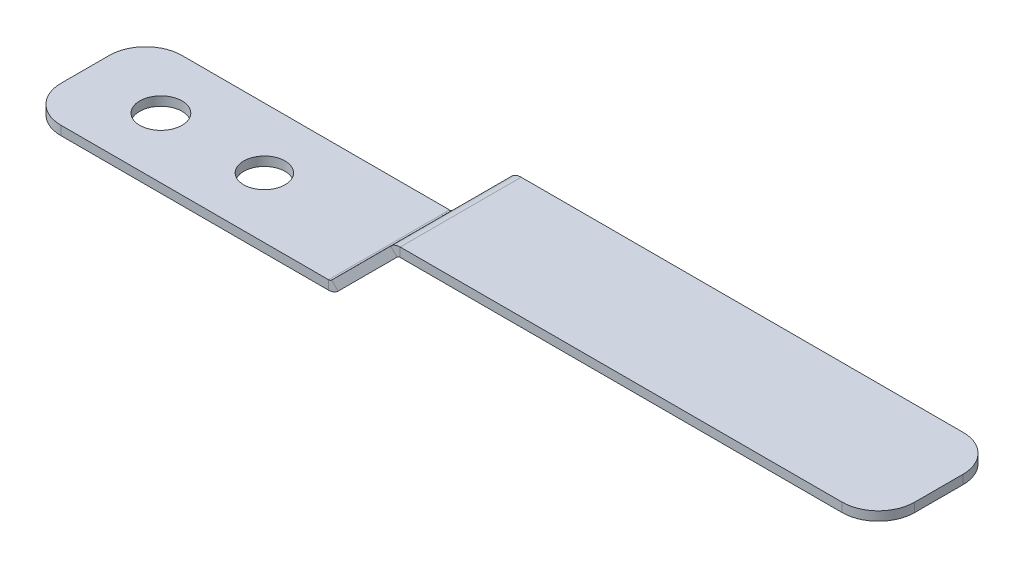
ISO-10303-21;
HEADER;
FILE_DESCRIPTION(('STEP AP214'),'2;1');
FILE_NAME('part.step','',(''),(''),'','','');
FILE_SCHEMA(('AUTOMOTIVE_DESIGN { 1 0 10303 214 1 1 1 1 }'));
ENDSEC;
DATA;
#1=APPLICATION_CONTEXT('core data for automotive mechanical design processes');
#2=APPLICATION_PROTOCOL_DEFINITION('international standard','automotive_design',2000,#1);
#3=PRODUCT_CONTEXT('',#1,'mechanical');
#4=PRODUCT('Part','Part','',(#3));
#5=PRODUCT_RELATED_PRODUCT_CATEGORY('part','',(#4));
#6=PRODUCT_DEFINITION_FORMATION('','',#4);
#7=PRODUCT_DEFINITION_CONTEXT('part definition',#1,'design');
#8=PRODUCT_DEFINITION('design','',#6,#7);
#9=PRODUCT_DEFINITION_SHAPE('','',#8);
#10=(LENGTH_UNIT() NAMED_UNIT(*) SI_UNIT(.MILLI.,.METRE.));
#11=(NAMED_UNIT(*) PLANE_ANGLE_UNIT() SI_UNIT($,.RADIAN.));
#12=(NAMED_UNIT(*) SI_UNIT($,.STERADIAN.) SOLID_ANGLE_UNIT());
#13=UNCERTAINTY_MEASURE_WITH_UNIT(LENGTH_MEASURE(1.E-05),#10,'distance_accuracy_value','');
#14=(GEOMETRIC_REPRESENTATION_CONTEXT(3) GLOBAL_UNCERTAINTY_ASSIGNED_CONTEXT((#13)) GLOBAL_UNIT_ASSIGNED_CONTEXT((#10,
#11,#12)) REPRESENTATION_CONTEXT('',''));
#15=CARTESIAN_POINT('',(0.,0.,0.));
#16=DIRECTION('',(0.,0.,1.));
#17=DIRECTION('',(1.,0.,0.));
#18=AXIS2_PLACEMENT_3D('',#15,#16,#17);
#19=CARTESIAN_POINT('',(69.964219907714,107.580840304424,20.));
#20=DIRECTION('',(0.,0.,1.));
#21=DIRECTION('',(1.,0.,0.));
#22=AXIS2_PLACEMENT_3D('',#19,#20,#21);
#23=PLANE('',#22);
#24=DIRECTION('',(0.706860060304083,-0.707353416014165,0.));
#25=VECTOR('',#24,1.);
#26=CARTESIAN_POINT('',(69.964219907714,107.580840304424,20.));
#27=LINE('',#26,#25);
#28=CARTESIAN_POINT('',(69.964219907714,107.580840304424,20.));
#29=VERTEX_POINT('',#28);
#30=CARTESIAN_POINT('',(71.0245099981701,106.519810180403,20.));
#31=VERTEX_POINT('',#30);
#32=EDGE_CURVE('E270',#29,#31,#27,.T.);
#33=ORIENTED_EDGE('',*,*,#32,.F.);
#34=CARTESIAN_POINT('',(69.443546787294,108.10187683066,20.));
#35=DIRECTION('',(0.,0.,-1.));
#36=DIRECTION('',(-1.,0.,0.));
#37=AXIS2_PLACEMENT_3D('',#34,#35,#36);
#38=CIRCLE('',#37,0.7366);
#39=CARTESIAN_POINT('',(69.443546787294,107.36527683066,20.));
#40=VERTEX_POINT('',#39);
#41=EDGE_CURVE('E186',#40,#29,#38,.F.);
#42=ORIENTED_EDGE('',*,*,#41,.F.);
#43=DIRECTION('',(0.,1.,0.));
#44=VECTOR('',#43,1.);
#45=CARTESIAN_POINT('',(69.443546787294,105.86527683066,20.));
#46=LINE('',#45,#44);
#47=CARTESIAN_POINT('',(69.443546787294,105.86527683066,20.));
#48=VERTEX_POINT('',#47);
#49=EDGE_CURVE('E267',#48,#40,#46,.T.);
#50=ORIENTED_EDGE('',*,*,#49,.F.);
#51=CARTESIAN_POINT('',(69.443546787294,108.10187683066,20.));
#52=DIRECTION('',(0.,0.,1.));
#53=DIRECTION('',(1.,0.,0.));
#54=AXIS2_PLACEMENT_3D('',#51,#52,#53);
#55=CIRCLE('',#54,2.2366);
#56=EDGE_CURVE('E196',#48,#31,#55,.T.);
#57=ORIENTED_EDGE('',*,*,#56,.T.);
#58=EDGE_LOOP('',(#33,#42,#50,#57));
#59=FACE_BOUND('',#58,.T.);
#60=ADVANCED_FACE('F37',(#59),#23,.T.);
#61=CARTESIAN_POINT('',(69.443546787294,105.86527683066,20.));
#62=DIRECTION('',(0.,0.,1.));
#63=DIRECTION('',(1.,0.,0.));
#64=AXIS2_PLACEMENT_3D('',#61,#62,#63);
#65=PLANE('',#64);
#66=DIRECTION('',(0.707353416014164,0.706860060304084,0.));
#67=VECTOR('',#66,1.);
#68=CARTESIAN_POINT('',(69.7485059805906,107.36527683066,20.));
#69=LINE('',#68,#67);
#70=CARTESIAN_POINT('',(79.7120651902022,117.321886785885,20.));
#71=VERTEX_POINT('',#70);
#72=EDGE_CURVE('E184',#29,#71,#69,.T.);
#73=ORIENTED_EDGE('',*,*,#72,.F.);
#74=ORIENTED_EDGE('',*,*,#32,.T.);
#75=DIRECTION('',(0.707353416014164,0.706860060304084,0.));
#76=VECTOR('',#75,1.);
#77=CARTESIAN_POINT('',(70.8087960710467,106.304246706639,20.));
#78=LINE('',#77,#76);
#79=CARTESIAN_POINT('',(80.7723552806583,116.260856661864,20.));
#80=VERTEX_POINT('',#79);
#81=EDGE_CURVE('E199',#31,#80,#78,.T.);
#82=ORIENTED_EDGE('',*,*,#81,.T.);
#83=DIRECTION('',(-0.706860060304083,0.707353416014165,0.));
#84=VECTOR('',#83,1.);
#85=CARTESIAN_POINT('',(80.7723552806583,116.260856661864,20.));
#86=LINE('',#85,#84);
#87=EDGE_CURVE('E164',#80,#71,#86,.T.);
#88=ORIENTED_EDGE('',*,*,#87,.T.);
#89=EDGE_LOOP('',(#73,#74,#82,#88));
#90=FACE_BOUND('',#89,.T.);
#91=ADVANCED_FACE('F392',(#90),#65,.T.);
#92=CARTESIAN_POINT('',(69.443546787294,107.36527683066,0.));
#93=DIRECTION('',(0.,0.,-1.));
#94=DIRECTION('',(-1.,0.,0.));
#95=AXIS2_PLACEMENT_3D('',#92,#93,#94);
#96=PLANE('',#95);
#97=DIRECTION('',(0.,-1.,0.));
#98=VECTOR('',#97,1.);
#99=CARTESIAN_POINT('',(69.443546787294,107.36527683066,0.));
#100=LINE('',#99,#98);
#101=CARTESIAN_POINT('',(69.443546787294,107.36527683066,0.));
#102=VERTEX_POINT('',#101);
#103=CARTESIAN_POINT('',(69.443546787294,105.86527683066,0.));
#104=VERTEX_POINT('',#103);
#105=EDGE_CURVE('E264',#102,#104,#100,.T.);
#106=ORIENTED_EDGE('',*,*,#105,.F.);
#107=CARTESIAN_POINT('',(69.443546787294,108.10187683066,0.));
#108=DIRECTION('',(0.,0.,-1.));
#109=DIRECTION('',(-1.,0.,0.));
#110=AXIS2_PLACEMENT_3D('',#107,#108,#109);
#111=CIRCLE('',#110,0.7366);
#112=CARTESIAN_POINT('',(69.964219907714,107.580840304424,0.));
#113=VERTEX_POINT('',#112);
#114=EDGE_CURVE('E214',#102,#113,#111,.F.);
#115=ORIENTED_EDGE('',*,*,#114,.T.);
#116=DIRECTION('',(-0.706860060304083,0.707353416014165,0.));
#117=VECTOR('',#116,1.);
#118=CARTESIAN_POINT('',(71.0245099981701,106.519810180403,0.));
#119=LINE('',#118,#117);
#120=CARTESIAN_POINT('',(71.0245099981701,106.519810180403,0.));
#121=VERTEX_POINT('',#120);
#122=EDGE_CURVE('E163',#121,#113,#119,.T.);
#123=ORIENTED_EDGE('',*,*,#122,.F.);
#124=CARTESIAN_POINT('',(69.443546787294,108.10187683066,0.));
#125=DIRECTION('',(0.,0.,1.));
#126=DIRECTION('',(1.,0.,0.));
#127=AXIS2_PLACEMENT_3D('',#124,#125,#126);
#128=CIRCLE('',#127,2.2366);
#129=EDGE_CURVE('E221',#104,#121,#128,.T.);
#130=ORIENTED_EDGE('',*,*,#129,.F.);
#131=EDGE_LOOP('',(#106,#115,#123,#130));
#132=FACE_BOUND('',#131,.T.);
#133=ADVANCED_FACE('F360',(#132),#96,.T.);
#134=CARTESIAN_POINT('',(71.0245099981701,106.519810180403,0.));
#135=DIRECTION('',(0.,0.,-1.));
#136=DIRECTION('',(-1.,0.,0.));
#137=AXIS2_PLACEMENT_3D('',#134,#135,#136);
#138=PLANE('',#137);
#139=DIRECTION('',(1.,0.,0.));
#140=VECTOR('',#139,1.);
#141=CARTESIAN_POINT('',(19.1848311400412,105.86527683066,0.));
#142=LINE('',#141,#140);
#143=CARTESIAN_POINT('',(25.1848311400412,105.86527683066,0.));
#144=VERTEX_POINT('',#143);
#145=EDGE_CURVE('E219',#144,#104,#142,.T.);
#146=ORIENTED_EDGE('',*,*,#145,.F.);
#147=DIRECTION('',(0.,1.,0.));
#148=VECTOR('',#147,1.);
#149=CARTESIAN_POINT('',(25.1848311400412,106.519810180403,0.));
#150=LINE('',#149,#148);
#151=CARTESIAN_POINT('',(25.1848311400412,107.36527683066,0.));
#152=VERTEX_POINT('',#151);
#153=EDGE_CURVE('E294',#144,#152,#150,.T.);
#154=ORIENTED_EDGE('',*,*,#153,.T.);
#155=DIRECTION('',(1.,0.,0.));
#156=VECTOR('',#155,1.);
#157=CARTESIAN_POINT('',(19.1848311400412,107.36527683066,0.));
#158=LINE('',#157,#156);
#159=EDGE_CURVE('E217',#152,#102,#158,.T.);
#160=ORIENTED_EDGE('',*,*,#159,.T.);
#161=ORIENTED_EDGE('',*,*,#105,.T.);
#162=EDGE_LOOP('',(#146,#154,#160,#161));
#163=FACE_BOUND('',#162,.T.);
#164=ADVANCED_FACE('F352',(#163),#138,.T.);
#165=CARTESIAN_POINT('',(81.2930284010783,117.976420135628,20.));
#166=DIRECTION('',(0.,0.,1.));
#167=DIRECTION('',(1.,0.,0.));
#168=AXIS2_PLACEMENT_3D('',#165,#166,#167);
#169=PLANE('',#168);
#170=DIRECTION('',(0.,-1.,0.));
#171=VECTOR('',#170,1.);
#172=CARTESIAN_POINT('',(81.2930284010783,117.976420135628,20.));
#173=LINE('',#172,#171);
#174=CARTESIAN_POINT('',(81.2930284010783,117.976420135628,20.));
#175=VERTEX_POINT('',#174);
#176=CARTESIAN_POINT('',(81.2930284010783,116.476420135628,20.));
#177=VERTEX_POINT('',#176);
#178=EDGE_CURVE('E154',#175,#177,#173,.T.);
#179=ORIENTED_EDGE('',*,*,#178,.F.);
#180=CARTESIAN_POINT('',(81.2930284010783,115.739820135628,20.));
#181=DIRECTION('',(0.,0.,1.));
#182=DIRECTION('',(1.,0.,0.));
#183=AXIS2_PLACEMENT_3D('',#180,#181,#182);
#184=CIRCLE('',#183,2.2366);
#185=EDGE_CURVE('E158',#71,#175,#184,.F.);
#186=ORIENTED_EDGE('',*,*,#185,.F.);
#187=ORIENTED_EDGE('',*,*,#87,.F.);
#188=CARTESIAN_POINT('',(81.2930284010783,115.739820135628,20.));
#189=DIRECTION('',(0.,0.,1.));
#190=DIRECTION('',(1.,0.,0.));
#191=AXIS2_PLACEMENT_3D('',#188,#189,#190);
#192=CIRCLE('',#191,0.7366);
#193=EDGE_CURVE('E161',#80,#177,#192,.F.);
#194=ORIENTED_EDGE('',*,*,#193,.T.);
#195=EDGE_LOOP('',(#179,#186,#187,#194));
#196=FACE_BOUND('',#195,.T.);
#197=ADVANCED_FACE('F156',(#196),#169,.T.);
#198=CARTESIAN_POINT('',(80.7723552806583,116.260856661864,20.));
#199=DIRECTION('',(0.,0.,1.));
#200=DIRECTION('',(1.,0.,0.));
#201=AXIS2_PLACEMENT_3D('',#198,#199,#200);
#202=PLANE('',#201);
#203=DIRECTION('',(1.,0.,0.));
#204=VECTOR('',#203,1.);
#205=CARTESIAN_POINT('',(80.3670553740252,116.476420135628,20.));
#206=LINE('',#205,#204);
#207=CARTESIAN_POINT('',(154.367055374025,116.476420135628,20.));
#208=VERTEX_POINT('',#207);
#209=EDGE_CURVE('E179',#177,#208,#206,.T.);
#210=ORIENTED_EDGE('',*,*,#209,.T.);
#211=DIRECTION('',(0.,-1.,0.));
#212=VECTOR('',#211,1.);
#213=CARTESIAN_POINT('',(154.367055374025,116.260856661864,20.));
#214=LINE('',#213,#212);
#215=CARTESIAN_POINT('',(154.367055374025,117.976420135628,20.));
#216=VERTEX_POINT('',#215);
#217=EDGE_CURVE('E60',#208,#216,#214,.F.);
#218=ORIENTED_EDGE('',*,*,#217,.T.);
#219=DIRECTION('',(1.,0.,0.));
#220=VECTOR('',#219,1.);
#221=CARTESIAN_POINT('',(80.3670553740252,117.976420135628,20.));
#222=LINE('',#221,#220);
#223=EDGE_CURVE('E169',#175,#216,#222,.T.);
#224=ORIENTED_EDGE('',*,*,#223,.F.);
#225=ORIENTED_EDGE('',*,*,#178,.T.);
#226=EDGE_LOOP('',(#210,#218,#224,#225));
#227=FACE_BOUND('',#226,.T.);
#228=ADVANCED_FACE('F178',(#227),#202,.T.);
#229=CARTESIAN_POINT('',(79.7120651902022,117.321886785885,0.));
#230=DIRECTION('',(0.,0.,-1.));
#231=DIRECTION('',(-1.,0.,0.));
#232=AXIS2_PLACEMENT_3D('',#229,#230,#231);
#233=PLANE('',#232);
#234=DIRECTION('',(0.706860060304083,-0.707353416014165,0.));
#235=VECTOR('',#234,1.);
#236=CARTESIAN_POINT('',(79.7120651902022,117.321886785885,0.));
#237=LINE('',#236,#235);
#238=CARTESIAN_POINT('',(79.7120651902022,117.321886785885,0.));
#239=VERTEX_POINT('',#238);
#240=CARTESIAN_POINT('',(80.7723552806583,116.260856661864,0.));
#241=VERTEX_POINT('',#240);
#242=EDGE_CURVE('E260',#239,#241,#237,.T.);
#243=ORIENTED_EDGE('',*,*,#242,.F.);
#244=CARTESIAN_POINT('',(81.2930284010783,115.739820135628,0.));
#245=DIRECTION('',(0.,0.,1.));
#246=DIRECTION('',(1.,0.,0.));
#247=AXIS2_PLACEMENT_3D('',#244,#245,#246);
#248=CIRCLE('',#247,2.2366);
#249=CARTESIAN_POINT('',(81.2930284010783,117.976420135628,0.));
#250=VERTEX_POINT('',#249);
#251=EDGE_CURVE('E209',#239,#250,#248,.F.);
#252=ORIENTED_EDGE('',*,*,#251,.T.);
#253=DIRECTION('',(0.,1.,0.));
#254=VECTOR('',#253,1.);
#255=CARTESIAN_POINT('',(81.2930284010783,116.476420135628,0.));
#256=LINE('',#255,#254);
#257=CARTESIAN_POINT('',(81.2930284010783,116.476420135628,0.));
#258=VERTEX_POINT('',#257);
#259=EDGE_CURVE('E258',#258,#250,#256,.T.);
#260=ORIENTED_EDGE('',*,*,#259,.F.);
#261=CARTESIAN_POINT('',(81.2930284010783,115.739820135628,0.));
#262=DIRECTION('',(0.,0.,1.));
#263=DIRECTION('',(1.,0.,0.));
#264=AXIS2_PLACEMENT_3D('',#261,#262,#263);
#265=CIRCLE('',#264,0.7366);
#266=EDGE_CURVE('E227',#241,#258,#265,.F.);
#267=ORIENTED_EDGE('',*,*,#266,.F.);
#268=EDGE_LOOP('',(#243,#252,#260,#267));
#269=FACE_BOUND('',#268,.T.);
#270=ADVANCED_FACE('F374',(#269),#233,.T.);
#271=CARTESIAN_POINT('',(81.2930284010783,116.476420135628,0.));
#272=DIRECTION('',(0.,0.,-1.));
#273=DIRECTION('',(-1.,0.,0.));
#274=AXIS2_PLACEMENT_3D('',#271,#272,#273);
#275=PLANE('',#274);
#276=DIRECTION('',(0.707353416014164,0.706860060304084,0.));
#277=VECTOR('',#276,1.);
#278=CARTESIAN_POINT('',(69.7485059805906,107.36527683066,0.));
#279=LINE('',#278,#277);
#280=EDGE_CURVE('E211',#113,#239,#279,.T.);
#281=ORIENTED_EDGE('',*,*,#280,.T.);
#282=ORIENTED_EDGE('',*,*,#242,.T.);
#283=DIRECTION('',(0.707353416014164,0.706860060304084,0.));
#284=VECTOR('',#283,1.);
#285=CARTESIAN_POINT('',(70.8087960710467,106.304246706639,0.));
#286=LINE('',#285,#284);
#287=EDGE_CURVE('E224',#121,#241,#286,.T.);
#288=ORIENTED_EDGE('',*,*,#287,.F.);
#289=ORIENTED_EDGE('',*,*,#122,.T.);
#290=EDGE_LOOP('',(#281,#282,#288,#289));
#291=FACE_BOUND('',#290,.T.);
#292=ADVANCED_FACE('F364',(#291),#275,.T.);
#293=CARTESIAN_POINT('',(80.3670553740252,116.476420135628,20.));
#294=DIRECTION('',(0.,1.,0.));
#295=DIRECTION('',(-1.,0.,0.));
#296=AXIS2_PLACEMENT_3D('',#293,#294,#295);
#297=PLANE('',#296);
#298=DIRECTION('',(0.,0.,-1.));
#299=VECTOR('',#298,1.);
#300=CARTESIAN_POINT('',(160.367055374025,116.476420135628,20.));
#301=LINE('',#300,#299);
#302=CARTESIAN_POINT('',(160.367055374025,116.476420135628,14.));
#303=VERTEX_POINT('',#302);
#304=CARTESIAN_POINT('',(160.367055374025,116.476420135628,6.));
#305=VERTEX_POINT('',#304);
#306=EDGE_CURVE('E255',#303,#305,#301,.T.);
#307=ORIENTED_EDGE('',*,*,#306,.F.);
#308=CARTESIAN_POINT('',(154.367055374025,116.476420135628,14.));
#309=DIRECTION('',(0.,1.,0.));
#310=DIRECTION('',(-1.,0.,0.));
#311=AXIS2_PLACEMENT_3D('',#308,#309,#310);
#312=CIRCLE('',#311,6.);
#313=EDGE_CURVE('E304',#303,#208,#312,.F.);
#314=ORIENTED_EDGE('',*,*,#313,.T.);
#315=ORIENTED_EDGE('',*,*,#209,.F.);
#316=DIRECTION('',(0.,0.,-1.));
#317=VECTOR('',#316,1.);
#318=CARTESIAN_POINT('',(81.2930284010783,116.476420135628,20.));
#319=LINE('',#318,#317);
#320=EDGE_CURVE('E203',#177,#258,#319,.T.);
#321=ORIENTED_EDGE('',*,*,#320,.T.);
#322=DIRECTION('',(1.,0.,0.));
#323=VECTOR('',#322,1.);
#324=CARTESIAN_POINT('',(80.3670553740252,116.476420135628,0.));
#325=LINE('',#324,#323);
#326=CARTESIAN_POINT('',(154.367055374025,116.476420135628,0.));
#327=VERTEX_POINT('',#326);
#328=EDGE_CURVE('E204',#258,#327,#325,.T.);
#329=ORIENTED_EDGE('',*,*,#328,.T.);
#330=CARTESIAN_POINT('',(154.367055374025,116.476420135628,6.));
#331=DIRECTION('',(0.,1.,0.));
#332=DIRECTION('',(-1.,0.,0.));
#333=AXIS2_PLACEMENT_3D('',#330,#331,#332);
#334=CIRCLE('',#333,6.);
#335=EDGE_CURVE('E302',#327,#305,#334,.F.);
#336=ORIENTED_EDGE('',*,*,#335,.T.);
#337=EDGE_LOOP('',(#307,#314,#315,#321,#329,#336));
#338=FACE_BOUND('',#337,.T.);
#339=ADVANCED_FACE('F317',(#338),#297,.F.);
#340=CARTESIAN_POINT('',(160.367055374025,117.976420135628,20.));
#341=DIRECTION('',(1.,0.,0.));
#342=DIRECTION('',(0.,0.,-1.));
#343=AXIS2_PLACEMENT_3D('',#340,#341,#342);
#344=PLANE('',#343);
#345=DIRECTION('',(0.,0.,-1.));
#346=VECTOR('',#345,1.);
#347=CARTESIAN_POINT('',(160.367055374025,117.976420135628,20.));
#348=LINE('',#347,#346);
#349=CARTESIAN_POINT('',(160.367055374025,117.976420135628,14.));
#350=VERTEX_POINT('',#349);
#351=CARTESIAN_POINT('',(160.367055374025,117.976420135628,6.));
#352=VERTEX_POINT('',#351);
#353=EDGE_CURVE('E175',#350,#352,#348,.T.);
#354=ORIENTED_EDGE('',*,*,#353,.F.);
#355=DIRECTION('',(0.,-1.,0.));
#356=VECTOR('',#355,1.);
#357=CARTESIAN_POINT('',(160.367055374025,117.976420135628,14.));
#358=LINE('',#357,#356);
#359=EDGE_CURVE('E299',#350,#303,#358,.T.);
#360=ORIENTED_EDGE('',*,*,#359,.T.);
#361=ORIENTED_EDGE('',*,*,#306,.T.);
#362=DIRECTION('',(0.,-1.,0.));
#363=VECTOR('',#362,1.);
#364=CARTESIAN_POINT('',(160.367055374025,117.976420135628,6.));
#365=LINE('',#364,#363);
#366=EDGE_CURVE('E297',#305,#352,#365,.F.);
#367=ORIENTED_EDGE('',*,*,#366,.T.);
#368=EDGE_LOOP('',(#354,#360,#361,#367));
#369=FACE_BOUND('',#368,.T.);
#370=ADVANCED_FACE('F311',(#369),#344,.T.);
#371=CARTESIAN_POINT('',(80.3670553740252,117.976420135628,20.));
#372=DIRECTION('',(0.,1.,0.));
#373=DIRECTION('',(-1.,0.,0.));
#374=AXIS2_PLACEMENT_3D('',#371,#372,#373);
#375=PLANE('',#374);
#376=ORIENTED_EDGE('',*,*,#223,.T.);
#377=CARTESIAN_POINT('',(154.367055374025,117.976420135628,14.));
#378=DIRECTION('',(0.,1.,0.));
#379=DIRECTION('',(-1.,0.,0.));
#380=AXIS2_PLACEMENT_3D('',#377,#378,#379);
#381=CIRCLE('',#380,6.);
#382=EDGE_CURVE('E45',#216,#350,#381,.T.);
#383=ORIENTED_EDGE('',*,*,#382,.T.);
#384=ORIENTED_EDGE('',*,*,#353,.T.);
#385=CARTESIAN_POINT('',(154.367055374025,117.976420135628,6.));
#386=DIRECTION('',(0.,1.,0.));
#387=DIRECTION('',(-1.,0.,0.));
#388=AXIS2_PLACEMENT_3D('',#385,#386,#387);
#389=CIRCLE('',#388,6.);
#390=CARTESIAN_POINT('',(154.367055374025,117.976420135628,0.));
#391=VERTEX_POINT('',#390);
#392=EDGE_CURVE('E52',#352,#391,#389,.T.);
#393=ORIENTED_EDGE('',*,*,#392,.T.);
#394=DIRECTION('',(1.,0.,0.));
#395=VECTOR('',#394,1.);
#396=CARTESIAN_POINT('',(80.3670553740252,117.976420135628,0.));
#397=LINE('',#396,#395);
#398=EDGE_CURVE('E171',#250,#391,#397,.T.);
#399=ORIENTED_EDGE('',*,*,#398,.F.);
#400=DIRECTION('',(0.,0.,-1.));
#401=VECTOR('',#400,1.);
#402=CARTESIAN_POINT('',(81.2930284010783,117.976420135628,20.));
#403=LINE('',#402,#401);
#404=EDGE_CURVE('E167',#175,#250,#403,.T.);
#405=ORIENTED_EDGE('',*,*,#404,.F.);
#406=EDGE_LOOP('',(#376,#383,#384,#393,#399,#405));
#407=FACE_BOUND('',#406,.T.);
#408=ADVANCED_FACE('F168',(#407),#375,.T.);
#409=CARTESIAN_POINT('',(81.2930284010783,115.739820135628,20.));
#410=DIRECTION('',(0.,0.,-1.));
#411=DIRECTION('',(-1.,0.,0.));
#412=AXIS2_PLACEMENT_3D('',#409,#410,#411);
#413=CYLINDRICAL_SURFACE('',#412,2.2366);
#414=ORIENTED_EDGE('',*,*,#251,.F.);
#415=DIRECTION('',(0.,0.,-1.));
#416=VECTOR('',#415,1.);
#417=CARTESIAN_POINT('',(79.7120651902022,117.321886785885,20.));
#418=LINE('',#417,#416);
#419=EDGE_CURVE('E176',#71,#239,#418,.T.);
#420=ORIENTED_EDGE('',*,*,#419,.F.);
#421=ORIENTED_EDGE('',*,*,#185,.T.);
#422=ORIENTED_EDGE('',*,*,#404,.T.);
#423=EDGE_LOOP('',(#414,#420,#421,#422));
#424=FACE_BOUND('',#423,.T.);
#425=ADVANCED_FACE('F182',(#424),#413,.T.);
#426=CARTESIAN_POINT('',(69.7485059805906,107.36527683066,20.));
#427=DIRECTION('',(-0.706860060304084,0.707353416014164,0.));
#428=DIRECTION('',(-0.707353416014164,-0.706860060304084,0.));
#429=AXIS2_PLACEMENT_3D('',#426,#427,#428);
#430=PLANE('',#429);
#431=ORIENTED_EDGE('',*,*,#280,.F.);
#432=DIRECTION('',(0.,0.,-1.));
#433=VECTOR('',#432,1.);
#434=CARTESIAN_POINT('',(69.964219907714,107.580840304424,20.));
#435=LINE('',#434,#433);
#436=EDGE_CURVE('E250',#29,#113,#435,.T.);
#437=ORIENTED_EDGE('',*,*,#436,.F.);
#438=ORIENTED_EDGE('',*,*,#72,.T.);
#439=ORIENTED_EDGE('',*,*,#419,.T.);
#440=EDGE_LOOP('',(#431,#437,#438,#439));
#441=FACE_BOUND('',#440,.T.);
#442=ADVANCED_FACE('F372',(#441),#430,.T.);
#443=CARTESIAN_POINT('',(69.443546787294,108.10187683066,20.));
#444=DIRECTION('',(0.,0.,-1.));
#445=DIRECTION('',(-1.,0.,0.));
#446=AXIS2_PLACEMENT_3D('',#443,#444,#445);
#447=CYLINDRICAL_SURFACE('',#446,0.7366);
#448=ORIENTED_EDGE('',*,*,#114,.F.);
#449=DIRECTION('',(0.,0.,-1.));
#450=VECTOR('',#449,1.);
#451=CARTESIAN_POINT('',(69.443546787294,107.36527683066,20.));
#452=LINE('',#451,#450);
#453=EDGE_CURVE('E247',#40,#102,#452,.T.);
#454=ORIENTED_EDGE('',*,*,#453,.F.);
#455=ORIENTED_EDGE('',*,*,#41,.T.);
#456=ORIENTED_EDGE('',*,*,#436,.T.);
#457=EDGE_LOOP('',(#448,#454,#455,#456));
#458=FACE_BOUND('',#457,.T.);
#459=ADVANCED_FACE('F331',(#458),#447,.F.);
#460=CARTESIAN_POINT('',(19.1848311400412,107.36527683066,20.));
#461=DIRECTION('',(0.,1.,0.));
#462=DIRECTION('',(0.,0.,1.));
#463=AXIS2_PLACEMENT_3D('',#460,#461,#462);
#464=PLANE('',#463);
#465=CARTESIAN_POINT('',(48.8278703709896,107.36527683066,10.));
#466=DIRECTION('',(0.,1.,0.));
#467=DIRECTION('',(0.,0.,1.));
#468=AXIS2_PLACEMENT_3D('',#465,#466,#467);
#469=CIRCLE('',#468,3.41681182988981);
#470=CARTESIAN_POINT('',(48.8278703709896,107.36527683066,13.4168118298898));
#471=VERTEX_POINT('',#470);
#472=EDGE_CURVE('E279',#471,#471,#469,.T.);
#473=ORIENTED_EDGE('',*,*,#472,.F.);
#474=EDGE_LOOP('',(#473));
#475=FACE_BOUND('',#474,.T.);
#476=CARTESIAN_POINT('',(31.7151295541152,107.36527683066,10.));
#477=DIRECTION('',(0.,1.,0.));
#478=DIRECTION('',(0.,0.,1.));
#479=AXIS2_PLACEMENT_3D('',#476,#477,#478);
#480=CIRCLE('',#479,3.5);
#481=CARTESIAN_POINT('',(31.7151295541152,107.36527683066,13.5));
#482=VERTEX_POINT('',#481);
#483=EDGE_CURVE('E275',#482,#482,#480,.T.);
#484=ORIENTED_EDGE('',*,*,#483,.F.);
#485=EDGE_LOOP('',(#484));
#486=FACE_BOUND('',#485,.T.);
#487=DIRECTION('',(0.,0.,-1.));
#488=VECTOR('',#487,1.);
#489=CARTESIAN_POINT('',(19.1848311400412,107.36527683066,20.));
#490=LINE('',#489,#488);
#491=CARTESIAN_POINT('',(19.1848311400412,107.36527683066,14.));
#492=VERTEX_POINT('',#491);
#493=CARTESIAN_POINT('',(19.1848311400412,107.36527683066,6.));
#494=VERTEX_POINT('',#493);
#495=EDGE_CURVE('E244',#492,#494,#490,.T.);
#496=ORIENTED_EDGE('',*,*,#495,.F.);
#497=CARTESIAN_POINT('',(25.1848311400412,107.36527683066,14.));
#498=DIRECTION('',(0.,1.,0.));
#499=DIRECTION('',(0.,0.,1.));
#500=AXIS2_PLACEMENT_3D('',#497,#498,#499);
#501=CIRCLE('',#500,6.);
#502=CARTESIAN_POINT('',(25.1848311400412,107.36527683066,20.));
#503=VERTEX_POINT('',#502);
#504=EDGE_CURVE('E286',#492,#503,#501,.T.);
#505=ORIENTED_EDGE('',*,*,#504,.T.);
#506=DIRECTION('',(1.,0.,0.));
#507=VECTOR('',#506,1.);
#508=CARTESIAN_POINT('',(19.1848311400412,107.36527683066,20.));
#509=LINE('',#508,#507);
#510=EDGE_CURVE('E192',#503,#40,#509,.T.);
#511=ORIENTED_EDGE('',*,*,#510,.T.);
#512=ORIENTED_EDGE('',*,*,#453,.T.);
#513=ORIENTED_EDGE('',*,*,#159,.F.);
#514=CARTESIAN_POINT('',(25.1848311400412,107.36527683066,6.));
#515=DIRECTION('',(0.,1.,0.));
#516=DIRECTION('',(0.,0.,1.));
#517=AXIS2_PLACEMENT_3D('',#514,#515,#516);
#518=CIRCLE('',#517,6.);
#519=EDGE_CURVE('E284',#152,#494,#518,.T.);
#520=ORIENTED_EDGE('',*,*,#519,.T.);
#521=EDGE_LOOP('',(#496,#505,#511,#512,#513,#520));
#522=FACE_BOUND('',#521,.T.);
#523=ADVANCED_FACE('F327',(#475,#486,#522),#464,.T.);
#524=CARTESIAN_POINT('',(19.1848311400412,105.86527683066,20.));
#525=DIRECTION('',(-1.,0.,0.));
#526=DIRECTION('',(0.,0.,1.));
#527=AXIS2_PLACEMENT_3D('',#524,#525,#526);
#528=PLANE('',#527);
#529=DIRECTION('',(0.,0.,-1.));
#530=VECTOR('',#529,1.);
#531=CARTESIAN_POINT('',(19.1848311400412,105.86527683066,20.));
#532=LINE('',#531,#530);
#533=CARTESIAN_POINT('',(19.1848311400412,105.86527683066,14.));
#534=VERTEX_POINT('',#533);
#535=CARTESIAN_POINT('',(19.1848311400412,105.86527683066,6.));
#536=VERTEX_POINT('',#535);
#537=EDGE_CURVE('E241',#534,#536,#532,.T.);
#538=ORIENTED_EDGE('',*,*,#537,.F.);
#539=DIRECTION('',(0.,1.,0.));
#540=VECTOR('',#539,1.);
#541=CARTESIAN_POINT('',(19.1848311400412,105.86527683066,14.));
#542=LINE('',#541,#540);
#543=EDGE_CURVE('E281',#534,#492,#542,.T.);
#544=ORIENTED_EDGE('',*,*,#543,.T.);
#545=ORIENTED_EDGE('',*,*,#495,.T.);
#546=DIRECTION('',(0.,1.,0.));
#547=VECTOR('',#546,1.);
#548=CARTESIAN_POINT('',(19.1848311400412,105.86527683066,6.));
#549=LINE('',#548,#547);
#550=EDGE_CURVE('E272',#494,#536,#549,.F.);
#551=ORIENTED_EDGE('',*,*,#550,.T.);
#552=EDGE_LOOP('',(#538,#544,#545,#551));
#553=FACE_BOUND('',#552,.T.);
#554=ADVANCED_FACE('F330',(#553),#528,.T.);
#555=CARTESIAN_POINT('',(19.1848311400412,105.86527683066,20.));
#556=DIRECTION('',(0.,1.,0.));
#557=DIRECTION('',(0.,0.,1.));
#558=AXIS2_PLACEMENT_3D('',#555,#556,#557);
#559=PLANE('',#558);
#560=CARTESIAN_POINT('',(48.8278703709896,105.86527683066,10.));
#561=DIRECTION('',(0.,1.,0.));
#562=DIRECTION('',(0.,0.,1.));
#563=AXIS2_PLACEMENT_3D('',#560,#561,#562);
#564=CIRCLE('',#563,3.41681182988981);
#565=CARTESIAN_POINT('',(48.8278703709896,105.86527683066,13.4168118298898));
#566=VERTEX_POINT('',#565);
#567=EDGE_CURVE('E276',#566,#566,#564,.T.);
#568=ORIENTED_EDGE('',*,*,#567,.T.);
#569=EDGE_LOOP('',(#568));
#570=FACE_BOUND('',#569,.T.);
#571=CARTESIAN_POINT('',(31.7151295541152,105.86527683066,10.));
#572=DIRECTION('',(0.,1.,0.));
#573=DIRECTION('',(0.,0.,1.));
#574=AXIS2_PLACEMENT_3D('',#571,#572,#573);
#575=CIRCLE('',#574,3.5);
#576=CARTESIAN_POINT('',(31.7151295541152,105.86527683066,13.5));
#577=VERTEX_POINT('',#576);
#578=EDGE_CURVE('E207',#577,#577,#575,.T.);
#579=ORIENTED_EDGE('',*,*,#578,.T.);
#580=EDGE_LOOP('',(#579));
#581=FACE_BOUND('',#580,.T.);
#582=DIRECTION('',(1.,0.,0.));
#583=VECTOR('',#582,1.);
#584=CARTESIAN_POINT('',(19.1848311400412,105.86527683066,20.));
#585=LINE('',#584,#583);
#586=CARTESIAN_POINT('',(25.1848311400412,105.86527683066,20.));
#587=VERTEX_POINT('',#586);
#588=EDGE_CURVE('E194',#587,#48,#585,.T.);
#589=ORIENTED_EDGE('',*,*,#588,.F.);
#590=CARTESIAN_POINT('',(25.1848311400412,105.86527683066,14.));
#591=DIRECTION('',(0.,1.,0.));
#592=DIRECTION('',(0.,0.,1.));
#593=AXIS2_PLACEMENT_3D('',#590,#591,#592);
#594=CIRCLE('',#593,6.);
#595=EDGE_CURVE('E292',#587,#534,#594,.F.);
#596=ORIENTED_EDGE('',*,*,#595,.T.);
#597=ORIENTED_EDGE('',*,*,#537,.T.);
#598=CARTESIAN_POINT('',(25.1848311400412,105.86527683066,6.));
#599=DIRECTION('',(0.,1.,0.));
#600=DIRECTION('',(0.,0.,1.));
#601=AXIS2_PLACEMENT_3D('',#598,#599,#600);
#602=CIRCLE('',#601,6.);
#603=EDGE_CURVE('E290',#536,#144,#602,.F.);
#604=ORIENTED_EDGE('',*,*,#603,.T.);
#605=ORIENTED_EDGE('',*,*,#145,.T.);
#606=DIRECTION('',(0.,0.,-1.));
#607=VECTOR('',#606,1.);
#608=CARTESIAN_POINT('',(69.443546787294,105.86527683066,20.));
#609=LINE('',#608,#607);
#610=EDGE_CURVE('E238',#48,#104,#609,.T.);
#611=ORIENTED_EDGE('',*,*,#610,.F.);
#612=EDGE_LOOP('',(#589,#596,#597,#604,#605,#611));
#613=FACE_BOUND('',#612,.T.);
#614=ADVANCED_FACE('F349',(#570,#581,#613),#559,.F.);
#615=CARTESIAN_POINT('',(69.443546787294,108.10187683066,20.));
#616=DIRECTION('',(0.,0.,-1.));
#617=DIRECTION('',(-1.,0.,0.));
#618=AXIS2_PLACEMENT_3D('',#615,#616,#617);
#619=CYLINDRICAL_SURFACE('',#618,2.2366);
#620=ORIENTED_EDGE('',*,*,#129,.T.);
#621=DIRECTION('',(0.,0.,-1.));
#622=VECTOR('',#621,1.);
#623=CARTESIAN_POINT('',(71.0245099981701,106.519810180403,20.));
#624=LINE('',#623,#622);
#625=EDGE_CURVE('E235',#31,#121,#624,.T.);
#626=ORIENTED_EDGE('',*,*,#625,.F.);
#627=ORIENTED_EDGE('',*,*,#56,.F.);
#628=ORIENTED_EDGE('',*,*,#610,.T.);
#629=EDGE_LOOP('',(#620,#626,#627,#628));
#630=FACE_BOUND('',#629,.T.);
#631=ADVANCED_FACE('F358',(#630),#619,.T.);
#632=CARTESIAN_POINT('',(70.8087960710467,106.304246706639,20.));
#633=DIRECTION('',(-0.706860060304084,0.707353416014164,0.));
#634=DIRECTION('',(-0.707353416014164,-0.706860060304084,0.));
#635=AXIS2_PLACEMENT_3D('',#632,#633,#634);
#636=PLANE('',#635);
#637=ORIENTED_EDGE('',*,*,#287,.T.);
#638=DIRECTION('',(0.,0.,-1.));
#639=VECTOR('',#638,1.);
#640=CARTESIAN_POINT('',(80.7723552806583,116.260856661864,20.));
#641=LINE('',#640,#639);
#642=EDGE_CURVE('E232',#80,#241,#641,.T.);
#643=ORIENTED_EDGE('',*,*,#642,.F.);
#644=ORIENTED_EDGE('',*,*,#81,.F.);
#645=ORIENTED_EDGE('',*,*,#625,.T.);
#646=EDGE_LOOP('',(#637,#643,#644,#645));
#647=FACE_BOUND('',#646,.T.);
#648=ADVANCED_FACE('F378',(#647),#636,.F.);
#649=CARTESIAN_POINT('',(81.2930284010783,115.739820135628,20.));
#650=DIRECTION('',(0.,0.,-1.));
#651=DIRECTION('',(-1.,0.,0.));
#652=AXIS2_PLACEMENT_3D('',#649,#650,#651);
#653=CYLINDRICAL_SURFACE('',#652,0.7366);
#654=ORIENTED_EDGE('',*,*,#266,.T.);
#655=ORIENTED_EDGE('',*,*,#320,.F.);
#656=ORIENTED_EDGE('',*,*,#193,.F.);
#657=ORIENTED_EDGE('',*,*,#642,.T.);
#658=EDGE_LOOP('',(#654,#655,#656,#657));
#659=FACE_BOUND('',#658,.T.);
#660=ADVANCED_FACE('F381',(#659),#653,.F.);
#661=CARTESIAN_POINT('',(81.2930284010783,115.739820135628,20.));
#662=DIRECTION('',(0.,0.,1.));
#663=DIRECTION('',(1.,0.,0.));
#664=AXIS2_PLACEMENT_3D('',#661,#662,#663);
#665=PLANE('',#664);
#666=ORIENTED_EDGE('',*,*,#510,.F.);
#667=DIRECTION('',(0.,1.,0.));
#668=VECTOR('',#667,1.);
#669=CARTESIAN_POINT('',(25.1848311400412,115.739820135628,20.));
#670=LINE('',#669,#668);
#671=EDGE_CURVE('E288',#503,#587,#670,.F.);
#672=ORIENTED_EDGE('',*,*,#671,.T.);
#673=ORIENTED_EDGE('',*,*,#588,.T.);
#674=ORIENTED_EDGE('',*,*,#49,.T.);
#675=EDGE_LOOP('',(#666,#672,#673,#674));
#676=FACE_BOUND('',#675,.T.);
#677=ADVANCED_FACE('F459',(#676),#665,.T.);
#678=CARTESIAN_POINT('',(81.2930284010783,115.739820135628,0.));
#679=DIRECTION('',(0.,0.,1.));
#680=DIRECTION('',(1.,0.,0.));
#681=AXIS2_PLACEMENT_3D('',#678,#679,#680);
#682=PLANE('',#681);
#683=ORIENTED_EDGE('',*,*,#398,.T.);
#684=DIRECTION('',(0.,-1.,0.));
#685=VECTOR('',#684,1.);
#686=CARTESIAN_POINT('',(154.367055374025,116.476420135628,0.));
#687=LINE('',#686,#685);
#688=EDGE_CURVE('E11',#391,#327,#687,.T.);
#689=ORIENTED_EDGE('',*,*,#688,.T.);
#690=ORIENTED_EDGE('',*,*,#328,.F.);
#691=ORIENTED_EDGE('',*,*,#259,.T.);
#692=EDGE_LOOP('',(#683,#689,#690,#691));
#693=FACE_BOUND('',#692,.T.);
#694=ADVANCED_FACE('F384',(#693),#682,.F.);
#695=CARTESIAN_POINT('',(31.7151295541152,104.36527683066,10.));
#696=DIRECTION('',(0.,1.,0.));
#697=DIRECTION('',(0.,0.,1.));
#698=AXIS2_PLACEMENT_3D('',#695,#696,#697);
#699=CYLINDRICAL_SURFACE('',#698,3.5);
#700=ORIENTED_EDGE('',*,*,#483,.T.);
#701=EDGE_LOOP('',(#700));
#702=FACE_BOUND('',#701,.T.);
#703=ORIENTED_EDGE('',*,*,#578,.F.);
#704=EDGE_LOOP('',(#703));
#705=FACE_BOUND('',#704,.T.);
#706=ADVANCED_FACE('F437',(#702,#705),#699,.F.);
#707=CARTESIAN_POINT('',(48.8278703709896,104.36527683066,10.));
#708=DIRECTION('',(0.,1.,0.));
#709=DIRECTION('',(0.,0.,1.));
#710=AXIS2_PLACEMENT_3D('',#707,#708,#709);
#711=CYLINDRICAL_SURFACE('',#710,3.41681182988981);
#712=ORIENTED_EDGE('',*,*,#472,.T.);
#713=EDGE_LOOP('',(#712));
#714=FACE_BOUND('',#713,.T.);
#715=ORIENTED_EDGE('',*,*,#567,.F.);
#716=EDGE_LOOP('',(#715));
#717=FACE_BOUND('',#716,.T.);
#718=ADVANCED_FACE('F324',(#714,#717),#711,.F.);
#719=CARTESIAN_POINT('',(25.1848311400412,105.86527683066,14.));
#720=DIRECTION('',(0.,1.,0.));
#721=DIRECTION('',(0.,0.,1.));
#722=AXIS2_PLACEMENT_3D('',#719,#720,#721);
#723=CYLINDRICAL_SURFACE('',#722,6.);
#724=ORIENTED_EDGE('',*,*,#595,.F.);
#725=ORIENTED_EDGE('',*,*,#671,.F.);
#726=ORIENTED_EDGE('',*,*,#504,.F.);
#727=ORIENTED_EDGE('',*,*,#543,.F.);
#728=EDGE_LOOP('',(#724,#725,#726,#727));
#729=FACE_BOUND('',#728,.T.);
#730=ADVANCED_FACE('F402',(#729),#723,.T.);
#731=CARTESIAN_POINT('',(25.1848311400412,106.519810180403,6.));
#732=DIRECTION('',(0.,1.,0.));
#733=DIRECTION('',(0.,0.,1.));
#734=AXIS2_PLACEMENT_3D('',#731,#732,#733);
#735=CYLINDRICAL_SURFACE('',#734,6.);
#736=ORIENTED_EDGE('',*,*,#603,.F.);
#737=ORIENTED_EDGE('',*,*,#550,.F.);
#738=ORIENTED_EDGE('',*,*,#519,.F.);
#739=ORIENTED_EDGE('',*,*,#153,.F.);
#740=EDGE_LOOP('',(#736,#737,#738,#739));
#741=FACE_BOUND('',#740,.T.);
#742=ADVANCED_FACE('F344',(#741),#735,.T.);
#743=CARTESIAN_POINT('',(154.367055374025,117.976420135628,14.));
#744=DIRECTION('',(0.,-1.,0.));
#745=DIRECTION('',(0.,0.,-1.));
#746=AXIS2_PLACEMENT_3D('',#743,#744,#745);
#747=CYLINDRICAL_SURFACE('',#746,6.);
#748=ORIENTED_EDGE('',*,*,#382,.F.);
#749=ORIENTED_EDGE('',*,*,#217,.F.);
#750=ORIENTED_EDGE('',*,*,#313,.F.);
#751=ORIENTED_EDGE('',*,*,#359,.F.);
#752=EDGE_LOOP('',(#748,#749,#750,#751));
#753=FACE_BOUND('',#752,.T.);
#754=ADVANCED_FACE('F314',(#753),#747,.T.);
#755=CARTESIAN_POINT('',(154.367055374025,115.739820135628,6.));
#756=DIRECTION('',(0.,1.,0.));
#757=DIRECTION('',(0.,0.,1.));
#758=AXIS2_PLACEMENT_3D('',#755,#756,#757);
#759=CYLINDRICAL_SURFACE('',#758,6.);
#760=ORIENTED_EDGE('',*,*,#392,.F.);
#761=ORIENTED_EDGE('',*,*,#366,.F.);
#762=ORIENTED_EDGE('',*,*,#335,.F.);
#763=ORIENTED_EDGE('',*,*,#688,.F.);
#764=EDGE_LOOP('',(#760,#761,#762,#763));
#765=FACE_BOUND('',#764,.T.);
#766=ADVANCED_FACE('F39',(#765),#759,.T.);
#767=CLOSED_SHELL('',(#60,#91,#133,#164,#197,#228,#270,#292,#339,#370,#408,#425,#442,#459,#523,
#554,#614,#631,#648,#660,#677,#694,#706,#718,#730,#742,#754,#766));
#768=MANIFOLD_SOLID_BREP('B2',#767);
#769=ADVANCED_BREP_SHAPE_REPRESENTATION('',(#18,#768),#14);
#770=SHAPE_DEFINITION_REPRESENTATION(#9,#769);
ENDSEC;
END-ISO-10303-21;
